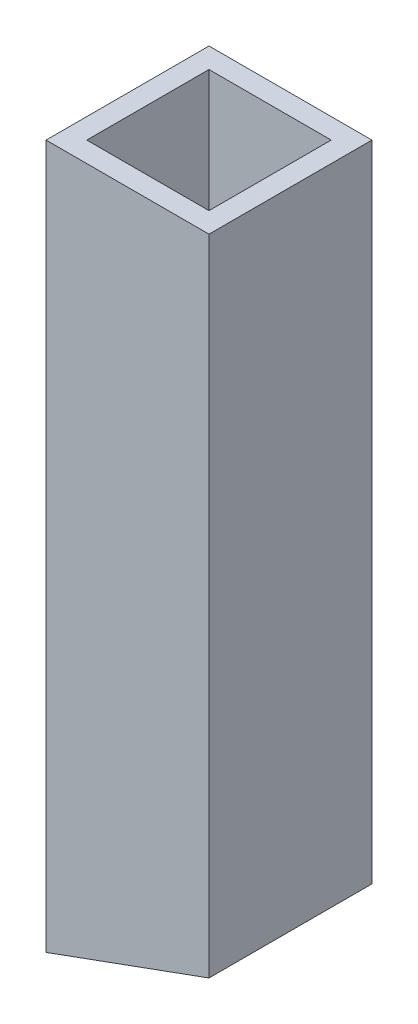
ISO-10303-21;
HEADER;
FILE_DESCRIPTION(('STEP AP214'),'2;1');
FILE_NAME('part.step','',(''),(''),'','','');
FILE_SCHEMA(('AUTOMOTIVE_DESIGN { 1 0 10303 214 1 1 1 1 }'));
ENDSEC;
DATA;
#1=APPLICATION_CONTEXT('core data for automotive mechanical design processes');
#2=APPLICATION_PROTOCOL_DEFINITION('international standard','automotive_design',2000,#1);
#3=PRODUCT_CONTEXT('',#1,'mechanical');
#4=PRODUCT('Part','Part','',(#3));
#5=PRODUCT_RELATED_PRODUCT_CATEGORY('part','',(#4));
#6=PRODUCT_DEFINITION_FORMATION('','',#4);
#7=PRODUCT_DEFINITION_CONTEXT('part definition',#1,'design');
#8=PRODUCT_DEFINITION('design','',#6,#7);
#9=PRODUCT_DEFINITION_SHAPE('','',#8);
#10=(LENGTH_UNIT() NAMED_UNIT(*) SI_UNIT(.MILLI.,.METRE.));
#11=(NAMED_UNIT(*) PLANE_ANGLE_UNIT() SI_UNIT($,.RADIAN.));
#12=(NAMED_UNIT(*) SI_UNIT($,.STERADIAN.) SOLID_ANGLE_UNIT());
#13=UNCERTAINTY_MEASURE_WITH_UNIT(LENGTH_MEASURE(1.E-05),#10,'distance_accuracy_value','');
#14=(GEOMETRIC_REPRESENTATION_CONTEXT(3) GLOBAL_UNCERTAINTY_ASSIGNED_CONTEXT((#13)) GLOBAL_UNIT_ASSIGNED_CONTEXT((#10,
#11,#12)) REPRESENTATION_CONTEXT('',''));
#15=CARTESIAN_POINT('',(0.,0.,0.));
#16=DIRECTION('',(0.,0.,1.));
#17=DIRECTION('',(1.,0.,0.));
#18=AXIS2_PLACEMENT_3D('',#15,#16,#17);
#19=CARTESIAN_POINT('',(-12.7,54.8320894818162,12.7));
#20=DIRECTION('',(1.,0.,0.));
#21=DIRECTION('',(0.,1.,0.));
#22=AXIS2_PLACEMENT_3D('',#19,#20,#21);
#23=PLANE('',#22);
#24=DIRECTION('',(0.,-1.,0.));
#25=VECTOR('',#24,1.);
#26=CARTESIAN_POINT('',(-12.7,54.8320894818162,-12.7));
#27=LINE('',#26,#25);
#28=CARTESIAN_POINT('',(-12.7,54.8320894818162,-12.7));
#29=VERTEX_POINT('',#28);
#30=CARTESIAN_POINT('',(-12.7,-54.8320894818161,-12.7));
#31=VERTEX_POINT('',#30);
#32=EDGE_CURVE('E134',#29,#31,#27,.T.);
#33=ORIENTED_EDGE('',*,*,#32,.T.);
#34=DIRECTION('',(0.,0.,-1.));
#35=VECTOR('',#34,1.);
#36=CARTESIAN_POINT('',(-12.7,-54.8320894818161,12.7));
#37=LINE('',#36,#35);
#38=CARTESIAN_POINT('',(-12.7,-54.8320894818161,12.7));
#39=VERTEX_POINT('',#38);
#40=EDGE_CURVE('E11',#39,#31,#37,.T.);
#41=ORIENTED_EDGE('',*,*,#40,.F.);
#42=DIRECTION('',(0.,-1.,0.));
#43=VECTOR('',#42,1.);
#44=CARTESIAN_POINT('',(-12.7,54.8320894818162,12.7));
#45=LINE('',#44,#43);
#46=CARTESIAN_POINT('',(-12.7,54.8320894818162,12.7));
#47=VERTEX_POINT('',#46);
#48=EDGE_CURVE('E135',#47,#39,#45,.T.);
#49=ORIENTED_EDGE('',*,*,#48,.F.);
#50=DIRECTION('',(0.,0.,-1.));
#51=VECTOR('',#50,1.);
#52=CARTESIAN_POINT('',(-12.7,54.8320894818162,12.7));
#53=LINE('',#52,#51);
#54=EDGE_CURVE('E145',#47,#29,#53,.T.);
#55=ORIENTED_EDGE('',*,*,#54,.T.);
#56=EDGE_LOOP('',(#33,#41,#49,#55));
#57=FACE_BOUND('',#56,.T.);
#58=ADVANCED_FACE('F33',(#57),#23,.F.);
#59=CARTESIAN_POINT('',(-12.7,-54.8320894818161,12.7));
#60=DIRECTION('',(-0.342020143325673,0.939692620785907,0.));
#61=DIRECTION('',(-0.939692620785907,-0.342020143325673,0.));
#62=AXIS2_PLACEMENT_3D('',#59,#60,#61);
#63=PLANE('',#62);
#64=DIRECTION('',(0.939692620785907,0.342020143325673,0.));
#65=VECTOR('',#64,1.);
#66=CARTESIAN_POINT('',(-12.7,-54.8320894818161,9.525));
#67=LINE('',#66,#65);
#68=CARTESIAN_POINT('',(-9.525,-53.6764839880209,9.525));
#69=VERTEX_POINT('',#68);
#70=CARTESIAN_POINT('',(9.525,-46.7428510252496,9.525));
#71=VERTEX_POINT('',#70);
#72=EDGE_CURVE('E128',#69,#71,#67,.T.);
#73=ORIENTED_EDGE('',*,*,#72,.T.);
#74=DIRECTION('',(0.,0.,-1.));
#75=VECTOR('',#74,1.);
#76=CARTESIAN_POINT('',(9.525,-46.7428510252496,12.7));
#77=LINE('',#76,#75);
#78=CARTESIAN_POINT('',(9.525,-46.7428510252496,-9.525));
#79=VERTEX_POINT('',#78);
#80=EDGE_CURVE('E131',#71,#79,#77,.T.);
#81=ORIENTED_EDGE('',*,*,#80,.T.);
#82=DIRECTION('',(-0.939692620785907,-0.342020143325673,0.));
#83=VECTOR('',#82,1.);
#84=CARTESIAN_POINT('',(-12.7,-54.8320894818161,-9.525));
#85=LINE('',#84,#83);
#86=CARTESIAN_POINT('',(-9.525,-53.6764839880209,-9.525));
#87=VERTEX_POINT('',#86);
#88=EDGE_CURVE('E123',#79,#87,#85,.T.);
#89=ORIENTED_EDGE('',*,*,#88,.T.);
#90=DIRECTION('',(0.,0.,1.));
#91=VECTOR('',#90,1.);
#92=CARTESIAN_POINT('',(-9.525,-53.6764839880209,12.7));
#93=LINE('',#92,#91);
#94=EDGE_CURVE('E103',#87,#69,#93,.T.);
#95=ORIENTED_EDGE('',*,*,#94,.T.);
#96=EDGE_LOOP('',(#73,#81,#89,#95));
#97=FACE_BOUND('',#96,.T.);
#98=DIRECTION('',(0.939692620785907,0.342020143325673,0.));
#99=VECTOR('',#98,1.);
#100=CARTESIAN_POINT('',(-12.7,-54.8320894818161,-12.7));
#101=LINE('',#100,#99);
#102=CARTESIAN_POINT('',(12.7,-45.5872455314544,-12.7));
#103=VERTEX_POINT('',#102);
#104=EDGE_CURVE('E148',#31,#103,#101,.T.);
#105=ORIENTED_EDGE('',*,*,#104,.T.);
#106=DIRECTION('',(0.,0.,-1.));
#107=VECTOR('',#106,1.);
#108=CARTESIAN_POINT('',(12.7,-45.5872455314544,12.7));
#109=LINE('',#108,#107);
#110=CARTESIAN_POINT('',(12.7,-45.5872455314544,12.7));
#111=VERTEX_POINT('',#110);
#112=EDGE_CURVE('E40',#111,#103,#109,.T.);
#113=ORIENTED_EDGE('',*,*,#112,.F.);
#114=DIRECTION('',(0.939692620785907,0.342020143325673,0.));
#115=VECTOR('',#114,1.);
#116=CARTESIAN_POINT('',(-12.7,-54.8320894818161,12.7));
#117=LINE('',#116,#115);
#118=EDGE_CURVE('E138',#39,#111,#117,.T.);
#119=ORIENTED_EDGE('',*,*,#118,.F.);
#120=ORIENTED_EDGE('',*,*,#40,.T.);
#121=EDGE_LOOP('',(#105,#113,#119,#120));
#122=FACE_BOUND('',#121,.T.);
#123=ADVANCED_FACE('F176',(#97,#122),#63,.F.);
#124=CARTESIAN_POINT('',(12.7,54.8320894818162,12.7));
#125=DIRECTION('',(-1.,0.,0.));
#126=DIRECTION('',(0.,-1.,0.));
#127=AXIS2_PLACEMENT_3D('',#124,#125,#126);
#128=PLANE('',#127);
#129=DIRECTION('',(0.,1.,0.));
#130=VECTOR('',#129,1.);
#131=CARTESIAN_POINT('',(12.7,54.8320894818162,-12.7));
#132=LINE('',#131,#130);
#133=CARTESIAN_POINT('',(12.7,54.8320894818162,-12.7));
#134=VERTEX_POINT('',#133);
#135=EDGE_CURVE('E150',#103,#134,#132,.T.);
#136=ORIENTED_EDGE('',*,*,#135,.T.);
#137=DIRECTION('',(0.,0.,-1.));
#138=VECTOR('',#137,1.);
#139=CARTESIAN_POINT('',(12.7,54.8320894818162,12.7));
#140=LINE('',#139,#138);
#141=CARTESIAN_POINT('',(12.7,54.8320894818162,12.7));
#142=VERTEX_POINT('',#141);
#143=EDGE_CURVE('E155',#142,#134,#140,.T.);
#144=ORIENTED_EDGE('',*,*,#143,.F.);
#145=DIRECTION('',(0.,1.,0.));
#146=VECTOR('',#145,1.);
#147=CARTESIAN_POINT('',(12.7,54.8320894818162,12.7));
#148=LINE('',#147,#146);
#149=EDGE_CURVE('E141',#111,#142,#148,.T.);
#150=ORIENTED_EDGE('',*,*,#149,.F.);
#151=ORIENTED_EDGE('',*,*,#112,.T.);
#152=EDGE_LOOP('',(#136,#144,#150,#151));
#153=FACE_BOUND('',#152,.T.);
#154=ADVANCED_FACE('F162',(#153),#128,.F.);
#155=CARTESIAN_POINT('',(-12.7,54.8320894818162,12.7));
#156=DIRECTION('',(0.,-1.,0.));
#157=DIRECTION('',(0.,0.,-1.));
#158=AXIS2_PLACEMENT_3D('',#155,#156,#157);
#159=PLANE('',#158);
#160=DIRECTION('',(-1.,0.,0.));
#161=VECTOR('',#160,1.);
#162=CARTESIAN_POINT('',(9.525,54.8320894818162,-9.525));
#163=LINE('',#162,#161);
#164=CARTESIAN_POINT('',(9.525,54.8320894818162,-9.525));
#165=VERTEX_POINT('',#164);
#166=CARTESIAN_POINT('',(-9.525,54.8320894818162,-9.525));
#167=VERTEX_POINT('',#166);
#168=EDGE_CURVE('E109',#165,#167,#163,.T.);
#169=ORIENTED_EDGE('',*,*,#168,.F.);
#170=DIRECTION('',(0.,0.,-1.));
#171=VECTOR('',#170,1.);
#172=CARTESIAN_POINT('',(9.525,54.8320894818162,9.525));
#173=LINE('',#172,#171);
#174=CARTESIAN_POINT('',(9.525,54.8320894818162,9.525));
#175=VERTEX_POINT('',#174);
#176=EDGE_CURVE('E55',#175,#165,#173,.T.);
#177=ORIENTED_EDGE('',*,*,#176,.F.);
#178=DIRECTION('',(1.,0.,0.));
#179=VECTOR('',#178,1.);
#180=CARTESIAN_POINT('',(-9.525,54.8320894818162,9.525));
#181=LINE('',#180,#179);
#182=CARTESIAN_POINT('',(-9.525,54.8320894818162,9.525));
#183=VERTEX_POINT('',#182);
#184=EDGE_CURVE('E116',#183,#175,#181,.T.);
#185=ORIENTED_EDGE('',*,*,#184,.F.);
#186=DIRECTION('',(0.,0.,1.));
#187=VECTOR('',#186,1.);
#188=CARTESIAN_POINT('',(-9.525,54.8320894818162,-9.525));
#189=LINE('',#188,#187);
#190=EDGE_CURVE('E100',#167,#183,#189,.T.);
#191=ORIENTED_EDGE('',*,*,#190,.F.);
#192=EDGE_LOOP('',(#169,#177,#185,#191));
#193=FACE_BOUND('',#192,.T.);
#194=DIRECTION('',(-1.,0.,0.));
#195=VECTOR('',#194,1.);
#196=CARTESIAN_POINT('',(-12.7,54.8320894818162,-12.7));
#197=LINE('',#196,#195);
#198=EDGE_CURVE('E139',#134,#29,#197,.T.);
#199=ORIENTED_EDGE('',*,*,#198,.T.);
#200=ORIENTED_EDGE('',*,*,#54,.F.);
#201=DIRECTION('',(-1.,0.,0.));
#202=VECTOR('',#201,1.);
#203=CARTESIAN_POINT('',(-12.7,54.8320894818162,12.7));
#204=LINE('',#203,#202);
#205=EDGE_CURVE('E143',#142,#47,#204,.T.);
#206=ORIENTED_EDGE('',*,*,#205,.F.);
#207=ORIENTED_EDGE('',*,*,#143,.T.);
#208=EDGE_LOOP('',(#199,#200,#206,#207));
#209=FACE_BOUND('',#208,.T.);
#210=ADVANCED_FACE('F113',(#193,#209),#159,.F.);
#211=CARTESIAN_POINT('',(0.,0.,12.7));
#212=DIRECTION('',(0.,0.,1.));
#213=DIRECTION('',(1.,0.,0.));
#214=AXIS2_PLACEMENT_3D('',#211,#212,#213);
#215=PLANE('',#214);
#216=ORIENTED_EDGE('',*,*,#48,.T.);
#217=ORIENTED_EDGE('',*,*,#118,.T.);
#218=ORIENTED_EDGE('',*,*,#149,.T.);
#219=ORIENTED_EDGE('',*,*,#205,.T.);
#220=EDGE_LOOP('',(#216,#217,#218,#219));
#221=FACE_BOUND('',#220,.T.);
#222=ADVANCED_FACE('F175',(#221),#215,.T.);
#223=CARTESIAN_POINT('',(0.,0.,-12.7));
#224=DIRECTION('',(0.,0.,1.));
#225=DIRECTION('',(1.,0.,0.));
#226=AXIS2_PLACEMENT_3D('',#223,#224,#225);
#227=PLANE('',#226);
#228=ORIENTED_EDGE('',*,*,#32,.F.);
#229=ORIENTED_EDGE('',*,*,#198,.F.);
#230=ORIENTED_EDGE('',*,*,#135,.F.);
#231=ORIENTED_EDGE('',*,*,#104,.F.);
#232=EDGE_LOOP('',(#228,#229,#230,#231));
#233=FACE_BOUND('',#232,.T.);
#234=ADVANCED_FACE('F168',(#233),#227,.F.);
#235=CARTESIAN_POINT('',(9.525,-54.8320894818161,9.525));
#236=DIRECTION('',(1.,0.,0.));
#237=DIRECTION('',(0.,0.,-1.));
#238=AXIS2_PLACEMENT_3D('',#235,#236,#237);
#239=PLANE('',#238);
#240=DIRECTION('',(0.,1.,0.));
#241=VECTOR('',#240,1.);
#242=CARTESIAN_POINT('',(9.525,-54.8320894818161,9.525));
#243=LINE('',#242,#241);
#244=EDGE_CURVE('E121',#71,#175,#243,.T.);
#245=ORIENTED_EDGE('',*,*,#244,.T.);
#246=ORIENTED_EDGE('',*,*,#176,.T.);
#247=DIRECTION('',(0.,1.,0.));
#248=VECTOR('',#247,1.);
#249=CARTESIAN_POINT('',(9.525,-54.8320894818161,-9.525));
#250=LINE('',#249,#248);
#251=EDGE_CURVE('E106',#79,#165,#250,.T.);
#252=ORIENTED_EDGE('',*,*,#251,.F.);
#253=ORIENTED_EDGE('',*,*,#80,.F.);
#254=EDGE_LOOP('',(#245,#246,#252,#253));
#255=FACE_BOUND('',#254,.T.);
#256=ADVANCED_FACE('F189',(#255),#239,.F.);
#257=CARTESIAN_POINT('',(-9.525,-54.8320894818161,9.525));
#258=DIRECTION('',(0.,0.,1.));
#259=DIRECTION('',(1.,0.,0.));
#260=AXIS2_PLACEMENT_3D('',#257,#258,#259);
#261=PLANE('',#260);
#262=DIRECTION('',(0.,1.,0.));
#263=VECTOR('',#262,1.);
#264=CARTESIAN_POINT('',(-9.525,-54.8320894818161,9.525));
#265=LINE('',#264,#263);
#266=EDGE_CURVE('E105',#69,#183,#265,.T.);
#267=ORIENTED_EDGE('',*,*,#266,.T.);
#268=ORIENTED_EDGE('',*,*,#184,.T.);
#269=ORIENTED_EDGE('',*,*,#244,.F.);
#270=ORIENTED_EDGE('',*,*,#72,.F.);
#271=EDGE_LOOP('',(#267,#268,#269,#270));
#272=FACE_BOUND('',#271,.T.);
#273=ADVANCED_FACE('F194',(#272),#261,.F.);
#274=CARTESIAN_POINT('',(-9.525,-54.8320894818161,-9.525));
#275=DIRECTION('',(-1.,0.,0.));
#276=DIRECTION('',(0.,0.,1.));
#277=AXIS2_PLACEMENT_3D('',#274,#275,#276);
#278=PLANE('',#277);
#279=DIRECTION('',(0.,1.,0.));
#280=VECTOR('',#279,1.);
#281=CARTESIAN_POINT('',(-9.525,-54.8320894818161,-9.525));
#282=LINE('',#281,#280);
#283=EDGE_CURVE('E47',#87,#167,#282,.T.);
#284=ORIENTED_EDGE('',*,*,#283,.T.);
#285=ORIENTED_EDGE('',*,*,#190,.T.);
#286=ORIENTED_EDGE('',*,*,#266,.F.);
#287=ORIENTED_EDGE('',*,*,#94,.F.);
#288=EDGE_LOOP('',(#284,#285,#286,#287));
#289=FACE_BOUND('',#288,.T.);
#290=ADVANCED_FACE('F97',(#289),#278,.F.);
#291=CARTESIAN_POINT('',(9.525,-54.8320894818161,-9.525));
#292=DIRECTION('',(0.,0.,-1.));
#293=DIRECTION('',(-1.,0.,0.));
#294=AXIS2_PLACEMENT_3D('',#291,#292,#293);
#295=PLANE('',#294);
#296=ORIENTED_EDGE('',*,*,#251,.T.);
#297=ORIENTED_EDGE('',*,*,#168,.T.);
#298=ORIENTED_EDGE('',*,*,#283,.F.);
#299=ORIENTED_EDGE('',*,*,#88,.F.);
#300=EDGE_LOOP('',(#296,#297,#298,#299));
#301=FACE_BOUND('',#300,.T.);
#302=ADVANCED_FACE('F110',(#301),#295,.F.);
#303=CLOSED_SHELL('',(#58,#123,#154,#210,#222,#234,#256,#273,#290,#302));
#304=MANIFOLD_SOLID_BREP('B2',#303);
#305=ADVANCED_BREP_SHAPE_REPRESENTATION('',(#18,#304),#14);
#306=SHAPE_DEFINITION_REPRESENTATION(#9,#305);
ENDSEC;
END-ISO-10303-21;
